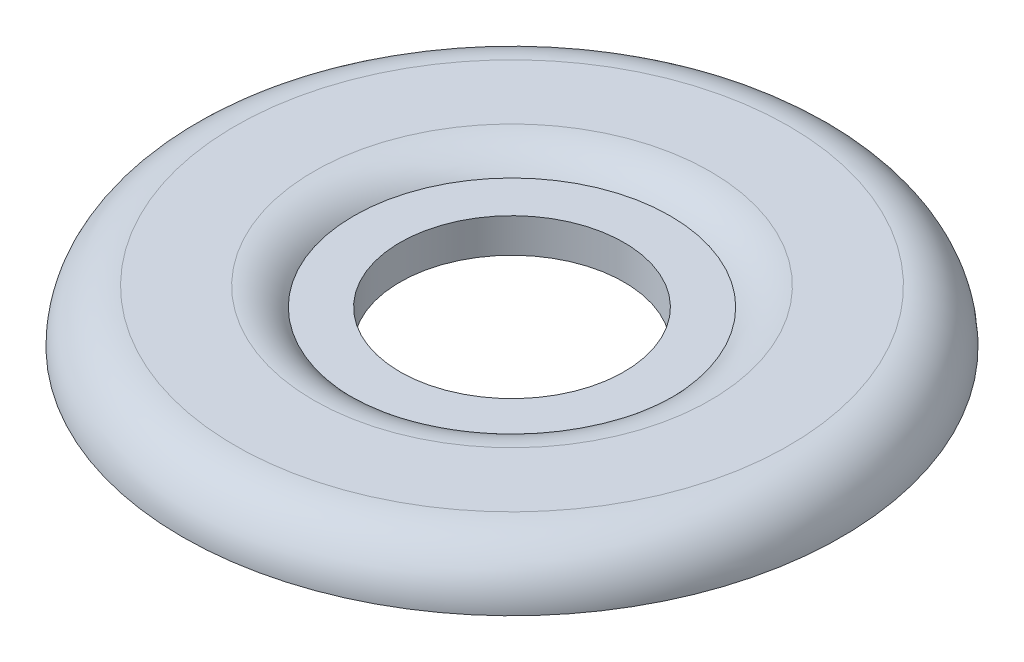
ISO-10303-21;
HEADER;
FILE_DESCRIPTION(('STEP AP214'),'2;1');
FILE_NAME('part.step','',(''),(''),'','','');
FILE_SCHEMA(('AUTOMOTIVE_DESIGN { 1 0 10303 214 1 1 1 1 }'));
ENDSEC;
DATA;
#1=APPLICATION_CONTEXT('core data for automotive mechanical design processes');
#2=APPLICATION_PROTOCOL_DEFINITION('international standard','automotive_design',2000,#1);
#3=PRODUCT_CONTEXT('',#1,'mechanical');
#4=PRODUCT('Part','Part','',(#3));
#5=PRODUCT_RELATED_PRODUCT_CATEGORY('part','',(#4));
#6=PRODUCT_DEFINITION_FORMATION('','',#4);
#7=PRODUCT_DEFINITION_CONTEXT('part definition',#1,'design');
#8=PRODUCT_DEFINITION('design','',#6,#7);
#9=PRODUCT_DEFINITION_SHAPE('','',#8);
#10=(LENGTH_UNIT() NAMED_UNIT(*) SI_UNIT(.MILLI.,.METRE.));
#11=(NAMED_UNIT(*) PLANE_ANGLE_UNIT() SI_UNIT($,.RADIAN.));
#12=(NAMED_UNIT(*) SI_UNIT($,.STERADIAN.) SOLID_ANGLE_UNIT());
#13=UNCERTAINTY_MEASURE_WITH_UNIT(LENGTH_MEASURE(1.E-05),#10,'distance_accuracy_value','');
#14=(GEOMETRIC_REPRESENTATION_CONTEXT(3) GLOBAL_UNCERTAINTY_ASSIGNED_CONTEXT((#13)) GLOBAL_UNIT_ASSIGNED_CONTEXT((#10,
#11,#12)) REPRESENTATION_CONTEXT('',''));
#15=CARTESIAN_POINT('',(0.,0.,0.));
#16=DIRECTION('',(0.,0.,1.));
#17=DIRECTION('',(1.,0.,0.));
#18=AXIS2_PLACEMENT_3D('',#15,#16,#17);
#19=CARTESIAN_POINT('',(0.,-0.300000000000002,0.));
#20=DIRECTION('',(0.,-1.,0.));
#21=DIRECTION('',(0.,0.,-1.));
#22=AXIS2_PLACEMENT_3D('',#19,#20,#21);
#23=PLANE('',#22);
#24=CARTESIAN_POINT('',(0.,-0.300000000000002,0.));
#25=DIRECTION('',(0.,-1.,0.));
#26=DIRECTION('',(0.,0.,-1.));
#27=AXIS2_PLACEMENT_3D('',#24,#25,#26);
#28=CIRCLE('',#27,8.51986841535707);
#29=CARTESIAN_POINT('',(0.,-0.300000000000002,-8.51986841535707));
#30=VERTEX_POINT('',#29);
#31=EDGE_CURVE('E10',#30,#30,#28,.F.);
#32=ORIENTED_EDGE('',*,*,#31,.T.);
#33=EDGE_LOOP('',(#32));
#34=FACE_BOUND('',#33,.T.);
#35=CARTESIAN_POINT('',(0.,-0.300000000000002,0.));
#36=DIRECTION('',(0.,-1.,0.));
#37=DIRECTION('',(0.,0.,-1.));
#38=AXIS2_PLACEMENT_3D('',#35,#36,#37);
#39=CIRCLE('',#38,9.48013158464293);
#40=CARTESIAN_POINT('',(0.,-0.300000000000002,-9.48013158464293));
#41=VERTEX_POINT('',#40);
#42=EDGE_CURVE('E50',#41,#41,#39,.T.);
#43=ORIENTED_EDGE('',*,*,#42,.T.);
#44=EDGE_LOOP('',(#43));
#45=FACE_BOUND('',#44,.T.);
#46=ADVANCED_FACE('F43',(#34,#45),#23,.T.);
#47=CARTESIAN_POINT('',(0.,-1.00000000000001,0.));
#48=DIRECTION('',(0.,-1.,0.));
#49=DIRECTION('',(0.,0.,-1.));
#50=AXIS2_PLACEMENT_3D('',#47,#48,#49);
#51=PLANE('',#50);
#52=CARTESIAN_POINT('',(0.,-1.00000000000001,0.));
#53=DIRECTION('',(0.,1.,0.));
#54=DIRECTION('',(0.,0.,1.));
#55=AXIS2_PLACEMENT_3D('',#52,#53,#54);
#56=CIRCLE('',#55,4.25);
#57=CARTESIAN_POINT('',(0.,-1.00000000000001,4.25));
#58=VERTEX_POINT('',#57);
#59=EDGE_CURVE('E66',#58,#58,#56,.T.);
#60=ORIENTED_EDGE('',*,*,#59,.T.);
#61=EDGE_LOOP('',(#60));
#62=FACE_BOUND('',#61,.T.);
#63=CARTESIAN_POINT('',(0.,-1.00000000000001,0.));
#64=DIRECTION('',(0.,1.,0.));
#65=DIRECTION('',(0.,0.,1.));
#66=AXIS2_PLACEMENT_3D('',#63,#64,#65);
#67=CIRCLE('',#66,7.);
#68=CARTESIAN_POINT('',(0.,-1.00000000000001,7.));
#69=VERTEX_POINT('',#68);
#70=EDGE_CURVE('E63',#69,#69,#67,.T.);
#71=ORIENTED_EDGE('',*,*,#70,.F.);
#72=EDGE_LOOP('',(#71));
#73=FACE_BOUND('',#72,.T.);
#74=ADVANCED_FACE('F94',(#62,#73),#51,.T.);
#75=CARTESIAN_POINT('',(0.,0.299999999999987,0.));
#76=DIRECTION('',(0.,1.,0.));
#77=DIRECTION('',(0.,0.,1.));
#78=AXIS2_PLACEMENT_3D('',#75,#76,#77);
#79=CYLINDRICAL_SURFACE('',#78,4.25);
#80=CARTESIAN_POINT('',(0.,0.299999999999987,0.));
#81=DIRECTION('',(0.,1.,0.));
#82=DIRECTION('',(0.,0.,1.));
#83=AXIS2_PLACEMENT_3D('',#80,#81,#82);
#84=CIRCLE('',#83,4.25);
#85=CARTESIAN_POINT('',(0.,0.299999999999987,4.25));
#86=VERTEX_POINT('',#85);
#87=EDGE_CURVE('E69',#86,#86,#84,.T.);
#88=ORIENTED_EDGE('',*,*,#87,.T.);
#89=EDGE_LOOP('',(#88));
#90=FACE_BOUND('',#89,.T.);
#91=ORIENTED_EDGE('',*,*,#59,.F.);
#92=EDGE_LOOP('',(#91));
#93=FACE_BOUND('',#92,.T.);
#94=ADVANCED_FACE('F99',(#90,#93),#79,.F.);
#95=CARTESIAN_POINT('',(0.,0.299999999999987,0.));
#96=DIRECTION('',(0.,1.,0.));
#97=DIRECTION('',(0.,0.,1.));
#98=AXIS2_PLACEMENT_3D('',#95,#96,#97);
#99=PLANE('',#98);
#100=CARTESIAN_POINT('',(0.,0.299999999999986,0.));
#101=DIRECTION('',(0.,1.,0.));
#102=DIRECTION('',(0.,0.,1.));
#103=AXIS2_PLACEMENT_3D('',#100,#101,#102);
#104=CIRCLE('',#103,6.);
#105=CARTESIAN_POINT('',(0.,0.299999999999986,6.));
#106=VERTEX_POINT('',#105);
#107=EDGE_CURVE('E72',#106,#106,#104,.T.);
#108=ORIENTED_EDGE('',*,*,#107,.T.);
#109=EDGE_LOOP('',(#108));
#110=FACE_BOUND('',#109,.T.);
#111=ORIENTED_EDGE('',*,*,#87,.F.);
#112=EDGE_LOOP('',(#111));
#113=FACE_BOUND('',#112,.T.);
#114=ADVANCED_FACE('F117',(#110,#113),#99,.T.);
#115=CARTESIAN_POINT('',(0.,0.999999999999997,0.));
#116=DIRECTION('',(0.,-1.,0.));
#117=DIRECTION('',(0.,0.,-1.));
#118=AXIS2_PLACEMENT_3D('',#115,#116,#117);
#119=PLANE('',#118);
#120=CARTESIAN_POINT('',(0.,0.999999999999997,0.));
#121=DIRECTION('',(0.,-1.,0.));
#122=DIRECTION('',(0.,0.,-1.));
#123=AXIS2_PLACEMENT_3D('',#120,#121,#122);
#124=CIRCLE('',#123,10.5);
#125=CARTESIAN_POINT('',(0.,0.999999999999997,-10.5));
#126=VERTEX_POINT('',#125);
#127=EDGE_CURVE('E54',#126,#126,#124,.F.);
#128=ORIENTED_EDGE('',*,*,#127,.T.);
#129=EDGE_LOOP('',(#128));
#130=FACE_BOUND('',#129,.T.);
#131=CARTESIAN_POINT('',(0.,0.999999999999997,0.));
#132=DIRECTION('',(0.,-1.,0.));
#133=DIRECTION('',(0.,0.,-1.));
#134=AXIS2_PLACEMENT_3D('',#131,#132,#133);
#135=CIRCLE('',#134,7.51986841535708);
#136=CARTESIAN_POINT('',(0.,0.999999999999997,-7.51986841535708));
#137=VERTEX_POINT('',#136);
#138=EDGE_CURVE('E58',#137,#137,#135,.T.);
#139=ORIENTED_EDGE('',*,*,#138,.T.);
#140=EDGE_LOOP('',(#139));
#141=FACE_BOUND('',#140,.T.);
#142=ADVANCED_FACE('F120',(#130,#141),#119,.F.);
#143=CARTESIAN_POINT('',(0.,-1.00000000000001,0.));
#144=DIRECTION('',(0.,1.,0.));
#145=DIRECTION('',(0.,0.,1.));
#146=AXIS2_PLACEMENT_3D('',#143,#144,#145);
#147=CIRCLE('',#146,11.);
#148=CARTESIAN_POINT('',(0.,-1.00000000000001,11.));
#149=VERTEX_POINT('',#148);
#150=EDGE_CURVE('E78',#149,#149,#147,.T.);
#151=ORIENTED_EDGE('',*,*,#150,.T.);
#152=EDGE_LOOP('',(#151));
#153=FACE_BOUND('',#152,.T.);
#154=CARTESIAN_POINT('',(0.,-1.00000000000001,0.));
#155=DIRECTION('',(0.,1.,0.));
#156=DIRECTION('',(0.,0.,1.));
#157=AXIS2_PLACEMENT_3D('',#154,#155,#156);
#158=CIRCLE('',#157,12.5);
#159=CARTESIAN_POINT('',(0.,-1.00000000000001,12.5));
#160=VERTEX_POINT('',#159);
#161=EDGE_CURVE('E75',#160,#160,#158,.T.);
#162=ORIENTED_EDGE('',*,*,#161,.F.);
#163=EDGE_LOOP('',(#162));
#164=FACE_BOUND('',#163,.T.);
#165=ADVANCED_FACE('F82',(#153,#164),#51,.T.);
#166=CARTESIAN_POINT('',(0.,-1.,0.));
#167=DIRECTION('',(0.,-1.,0.));
#168=DIRECTION('',(0.,0.,-1.));
#169=AXIS2_PLACEMENT_3D('',#166,#167,#168);
#170=TOROIDAL_SURFACE('',#169,10.5,2.);
#171=ORIENTED_EDGE('',*,*,#161,.T.);
#172=EDGE_LOOP('',(#171));
#173=FACE_BOUND('',#172,.T.);
#174=ORIENTED_EDGE('',*,*,#127,.F.);
#175=EDGE_LOOP('',(#174));
#176=FACE_BOUND('',#175,.T.);
#177=ADVANCED_FACE('F105',(#173,#176),#170,.T.);
#178=CARTESIAN_POINT('',(0.,-1.,0.));
#179=DIRECTION('',(0.,-1.,0.));
#180=DIRECTION('',(0.,0.,-1.));
#181=AXIS2_PLACEMENT_3D('',#178,#179,#180);
#182=TOROIDAL_SURFACE('',#181,7.51986841535708,2.);
#183=ORIENTED_EDGE('',*,*,#138,.F.);
#184=EDGE_LOOP('',(#183));
#185=FACE_BOUND('',#184,.T.);
#186=ORIENTED_EDGE('',*,*,#107,.F.);
#187=EDGE_LOOP('',(#186));
#188=FACE_BOUND('',#187,.T.);
#189=ADVANCED_FACE('F91',(#185,#188),#182,.T.);
#190=CARTESIAN_POINT('',(0.,-2.3,0.));
#191=DIRECTION('',(0.,-1.,0.));
#192=DIRECTION('',(0.,0.,-1.));
#193=AXIS2_PLACEMENT_3D('',#190,#191,#192);
#194=TOROIDAL_SURFACE('',#193,8.51986841535707,2.);
#195=ORIENTED_EDGE('',*,*,#70,.T.);
#196=EDGE_LOOP('',(#195));
#197=FACE_BOUND('',#196,.T.);
#198=ORIENTED_EDGE('',*,*,#31,.F.);
#199=EDGE_LOOP('',(#198));
#200=FACE_BOUND('',#199,.T.);
#201=ADVANCED_FACE('F86',(#197,#200),#194,.F.);
#202=CARTESIAN_POINT('',(0.,-2.3,0.));
#203=DIRECTION('',(0.,1.,0.));
#204=DIRECTION('',(0.,0.,1.));
#205=AXIS2_PLACEMENT_3D('',#202,#203,#204);
#206=TOROIDAL_SURFACE('',#205,9.48013158464293,2.);
#207=ORIENTED_EDGE('',*,*,#42,.F.);
#208=EDGE_LOOP('',(#207));
#209=FACE_BOUND('',#208,.T.);
#210=ORIENTED_EDGE('',*,*,#150,.F.);
#211=EDGE_LOOP('',(#210));
#212=FACE_BOUND('',#211,.T.);
#213=ADVANCED_FACE('F45',(#209,#212),#206,.F.);
#214=CLOSED_SHELL('',(#46,#74,#94,#114,#142,#165,#177,#189,#201,#213));
#215=MANIFOLD_SOLID_BREP('B2',#214);
#216=ADVANCED_BREP_SHAPE_REPRESENTATION('',(#18,#215),#14);
#217=SHAPE_DEFINITION_REPRESENTATION(#9,#216);
ENDSEC;
END-ISO-10303-21;
